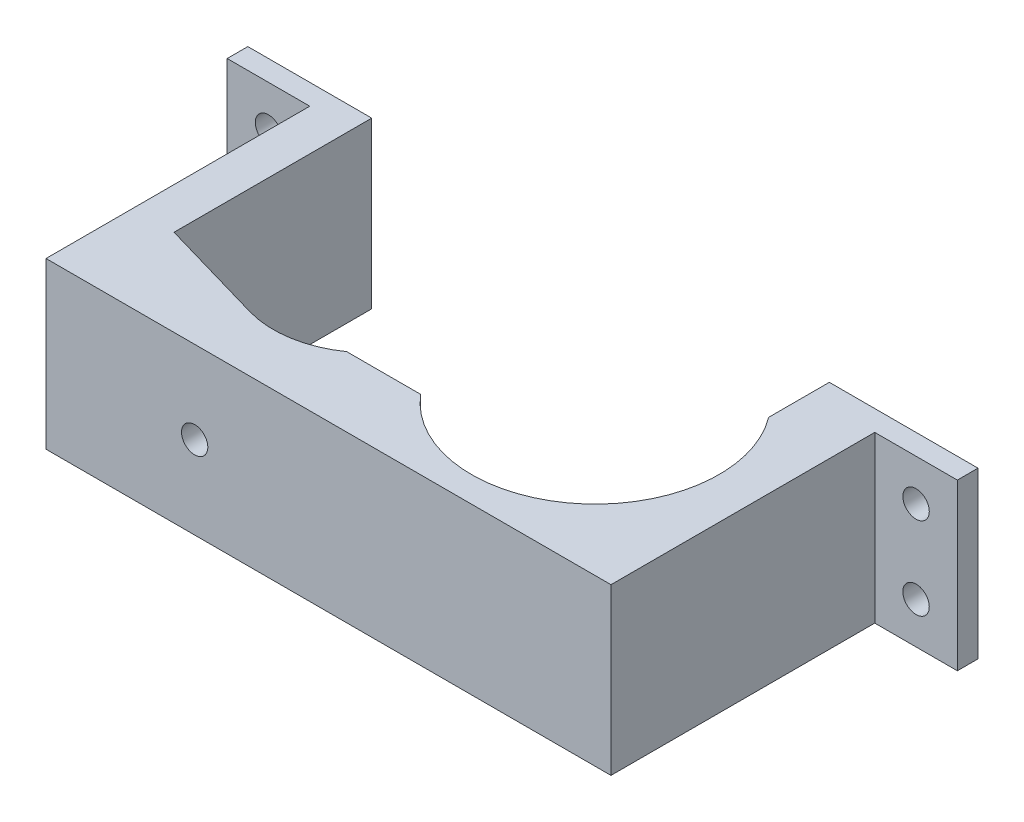
ISO-10303-21;
HEADER;
FILE_DESCRIPTION(('STEP AP214'),'2;1');
FILE_NAME('part.step','',(''),(''),'','','');
FILE_SCHEMA(('AUTOMOTIVE_DESIGN { 1 0 10303 214 1 1 1 1 }'));
ENDSEC;
DATA;
#1=APPLICATION_CONTEXT('core data for automotive mechanical design processes');
#2=APPLICATION_PROTOCOL_DEFINITION('international standard','automotive_design',2000,#1);
#3=PRODUCT_CONTEXT('',#1,'mechanical');
#4=PRODUCT('Part','Part','',(#3));
#5=PRODUCT_RELATED_PRODUCT_CATEGORY('part','',(#4));
#6=PRODUCT_DEFINITION_FORMATION('','',#4);
#7=PRODUCT_DEFINITION_CONTEXT('part definition',#1,'design');
#8=PRODUCT_DEFINITION('design','',#6,#7);
#9=PRODUCT_DEFINITION_SHAPE('','',#8);
#10=(LENGTH_UNIT() NAMED_UNIT(*) SI_UNIT(.MILLI.,.METRE.));
#11=(NAMED_UNIT(*) PLANE_ANGLE_UNIT() SI_UNIT($,.RADIAN.));
#12=(NAMED_UNIT(*) SI_UNIT($,.STERADIAN.) SOLID_ANGLE_UNIT());
#13=UNCERTAINTY_MEASURE_WITH_UNIT(LENGTH_MEASURE(1.E-05),#10,'distance_accuracy_value','');
#14=(GEOMETRIC_REPRESENTATION_CONTEXT(3) GLOBAL_UNCERTAINTY_ASSIGNED_CONTEXT((#13)) GLOBAL_UNIT_ASSIGNED_CONTEXT((#10,
#11,#12)) REPRESENTATION_CONTEXT('',''));
#15=CARTESIAN_POINT('',(0.,0.,0.));
#16=DIRECTION('',(0.,0.,1.));
#17=DIRECTION('',(1.,0.,0.));
#18=AXIS2_PLACEMENT_3D('',#15,#16,#17);
#19=CARTESIAN_POINT('',(-20.574,25.4,-9.65199999999999));
#20=DIRECTION('',(-1.,0.,0.));
#21=DIRECTION('',(0.,0.,1.));
#22=AXIS2_PLACEMENT_3D('',#19,#20,#21);
#23=PLANE('',#22);
#24=DIRECTION('',(0.,0.,-1.));
#25=VECTOR('',#24,1.);
#26=CARTESIAN_POINT('',(-20.574,0.,-9.65199999999999));
#27=LINE('',#26,#25);
#28=CARTESIAN_POINT('',(-20.574,0.,9.65212960437079));
#29=VERTEX_POINT('',#28);
#30=CARTESIAN_POINT('',(-20.574,0.,-20.7467128871305));
#31=VERTEX_POINT('',#30);
#32=EDGE_CURVE('E122',#29,#31,#27,.T.);
#33=ORIENTED_EDGE('',*,*,#32,.T.);
#34=DIRECTION('',(0.,-1.,0.));
#35=VECTOR('',#34,1.);
#36=CARTESIAN_POINT('',(-20.574,25.4,-20.7467128871305));
#37=LINE('',#36,#35);
#38=CARTESIAN_POINT('',(-20.574,25.4,-20.7467128871305));
#39=VERTEX_POINT('',#38);
#40=EDGE_CURVE('E54',#39,#31,#37,.T.);
#41=ORIENTED_EDGE('',*,*,#40,.F.);
#42=DIRECTION('',(0.,0.,-1.));
#43=VECTOR('',#42,1.);
#44=CARTESIAN_POINT('',(-20.574,25.4,-9.65199999999999));
#45=LINE('',#44,#43);
#46=CARTESIAN_POINT('',(-20.574,25.4,9.65212960437079));
#47=VERTEX_POINT('',#46);
#48=EDGE_CURVE('E128',#47,#39,#45,.T.);
#49=ORIENTED_EDGE('',*,*,#48,.F.);
#50=DIRECTION('',(0.,-1.,0.));
#51=VECTOR('',#50,1.);
#52=CARTESIAN_POINT('',(-20.574,25.4,9.65212960437079));
#53=LINE('',#52,#51);
#54=EDGE_CURVE('E191',#47,#29,#53,.T.);
#55=ORIENTED_EDGE('',*,*,#54,.T.);
#56=EDGE_LOOP('',(#33,#41,#49,#55));
#57=FACE_BOUND('',#56,.T.);
#58=ADVANCED_FACE('F41',(#57),#23,.F.);
#59=CARTESIAN_POINT('',(-39.624,25.4,-20.7467128871305));
#60=DIRECTION('',(0.,0.,1.));
#61=DIRECTION('',(1.,0.,0.));
#62=AXIS2_PLACEMENT_3D('',#59,#60,#61);
#63=PLANE('',#62);
#64=CARTESIAN_POINT('',(-33.274,6.35,-20.7467128871305));
#65=DIRECTION('',(0.,0.,1.));
#66=DIRECTION('',(1.,0.,0.));
#67=AXIS2_PLACEMENT_3D('',#64,#65,#66);
#68=CIRCLE('',#67,2.032);
#69=CARTESIAN_POINT('',(-31.242,6.35,-20.7467128871305));
#70=VERTEX_POINT('',#69);
#71=EDGE_CURVE('E322',#70,#70,#68,.T.);
#72=ORIENTED_EDGE('',*,*,#71,.T.);
#73=EDGE_LOOP('',(#72));
#74=FACE_BOUND('',#73,.T.);
#75=CARTESIAN_POINT('',(-33.274,19.05,-20.7467128871305));
#76=DIRECTION('',(0.,0.,1.));
#77=DIRECTION('',(1.,0.,0.));
#78=AXIS2_PLACEMENT_3D('',#75,#76,#77);
#79=CIRCLE('',#78,2.03200000000002);
#80=CARTESIAN_POINT('',(-31.242,19.05,-20.7467128871305));
#81=VERTEX_POINT('',#80);
#82=EDGE_CURVE('E197',#81,#81,#79,.T.);
#83=ORIENTED_EDGE('',*,*,#82,.T.);
#84=EDGE_LOOP('',(#83));
#85=FACE_BOUND('',#84,.T.);
#86=DIRECTION('',(-1.,0.,0.));
#87=VECTOR('',#86,1.);
#88=CARTESIAN_POINT('',(-39.624,0.,-20.7467128871305));
#89=LINE('',#88,#87);
#90=CARTESIAN_POINT('',(-39.624,0.,-20.7467128871305));
#91=VERTEX_POINT('',#90);
#92=EDGE_CURVE('E196',#31,#91,#89,.T.);
#93=ORIENTED_EDGE('',*,*,#92,.T.);
#94=DIRECTION('',(0.,-1.,0.));
#95=VECTOR('',#94,1.);
#96=CARTESIAN_POINT('',(-39.624,25.4,-20.7467128871305));
#97=LINE('',#96,#95);
#98=CARTESIAN_POINT('',(-39.624,25.4,-20.7467128871305));
#99=VERTEX_POINT('',#98);
#100=EDGE_CURVE('E258',#99,#91,#97,.T.);
#101=ORIENTED_EDGE('',*,*,#100,.F.);
#102=DIRECTION('',(-1.,0.,0.));
#103=VECTOR('',#102,1.);
#104=CARTESIAN_POINT('',(-39.624,25.4,-20.7467128871305));
#105=LINE('',#104,#103);
#106=EDGE_CURVE('E265',#39,#99,#105,.T.);
#107=ORIENTED_EDGE('',*,*,#106,.F.);
#108=ORIENTED_EDGE('',*,*,#40,.T.);
#109=EDGE_LOOP('',(#93,#101,#107,#108));
#110=FACE_BOUND('',#109,.T.);
#111=ADVANCED_FACE('F263',(#74,#85,#110),#63,.F.);
#112=CARTESIAN_POINT('',(-39.624,25.4,-20.7467128871305));
#113=DIRECTION('',(1.,0.,0.));
#114=DIRECTION('',(0.,0.,-1.));
#115=AXIS2_PLACEMENT_3D('',#112,#113,#114);
#116=PLANE('',#115);
#117=DIRECTION('',(0.,0.,1.));
#118=VECTOR('',#117,1.);
#119=CARTESIAN_POINT('',(-39.624,0.,-20.7467128871305));
#120=LINE('',#119,#118);
#121=CARTESIAN_POINT('',(-39.624,0.,-17.5717128871305));
#122=VERTEX_POINT('',#121);
#123=EDGE_CURVE('E199',#91,#122,#120,.T.);
#124=ORIENTED_EDGE('',*,*,#123,.T.);
#125=DIRECTION('',(0.,-1.,0.));
#126=VECTOR('',#125,1.);
#127=CARTESIAN_POINT('',(-39.624,25.4,-17.5717128871305));
#128=LINE('',#127,#126);
#129=CARTESIAN_POINT('',(-39.624,25.4,-17.5717128871305));
#130=VERTEX_POINT('',#129);
#131=EDGE_CURVE('E255',#130,#122,#128,.T.);
#132=ORIENTED_EDGE('',*,*,#131,.F.);
#133=DIRECTION('',(0.,0.,1.));
#134=VECTOR('',#133,1.);
#135=CARTESIAN_POINT('',(-39.624,25.4,-20.7467128871305));
#136=LINE('',#135,#134);
#137=EDGE_CURVE('E281',#99,#130,#136,.T.);
#138=ORIENTED_EDGE('',*,*,#137,.F.);
#139=ORIENTED_EDGE('',*,*,#100,.T.);
#140=EDGE_LOOP('',(#124,#132,#138,#139));
#141=FACE_BOUND('',#140,.T.);
#142=ADVANCED_FACE('F272',(#141),#116,.F.);
#143=CARTESIAN_POINT('',(-39.624,25.4,-17.5717128871305));
#144=DIRECTION('',(0.,0.,-1.));
#145=DIRECTION('',(-1.,0.,0.));
#146=AXIS2_PLACEMENT_3D('',#143,#144,#145);
#147=PLANE('',#146);
#148=CARTESIAN_POINT('',(-33.274,6.35,-17.5717128871305));
#149=DIRECTION('',(0.,0.,1.));
#150=DIRECTION('',(1.,0.,0.));
#151=AXIS2_PLACEMENT_3D('',#148,#149,#150);
#152=CIRCLE('',#151,2.032);
#153=CARTESIAN_POINT('',(-31.242,6.35,-17.5717128871305));
#154=VERTEX_POINT('',#153);
#155=EDGE_CURVE('E326',#154,#154,#152,.T.);
#156=ORIENTED_EDGE('',*,*,#155,.F.);
#157=EDGE_LOOP('',(#156));
#158=FACE_BOUND('',#157,.T.);
#159=CARTESIAN_POINT('',(-33.274,19.05,-17.5717128871305));
#160=DIRECTION('',(0.,0.,1.));
#161=DIRECTION('',(1.,0.,0.));
#162=AXIS2_PLACEMENT_3D('',#159,#160,#161);
#163=CIRCLE('',#162,2.03200000000002);
#164=CARTESIAN_POINT('',(-31.242,19.05,-17.5717128871305));
#165=VERTEX_POINT('',#164);
#166=EDGE_CURVE('E325',#165,#165,#163,.T.);
#167=ORIENTED_EDGE('',*,*,#166,.F.);
#168=EDGE_LOOP('',(#167));
#169=FACE_BOUND('',#168,.T.);
#170=DIRECTION('',(1.,0.,0.));
#171=VECTOR('',#170,1.);
#172=CARTESIAN_POINT('',(-39.624,0.,-17.5717128871305));
#173=LINE('',#172,#171);
#174=CARTESIAN_POINT('',(-26.924,0.,-17.5717128871305));
#175=VERTEX_POINT('',#174);
#176=EDGE_CURVE('E201',#122,#175,#173,.T.);
#177=ORIENTED_EDGE('',*,*,#176,.T.);
#178=DIRECTION('',(0.,-1.,0.));
#179=VECTOR('',#178,1.);
#180=CARTESIAN_POINT('',(-26.924,25.4,-17.5717128871305));
#181=LINE('',#180,#179);
#182=CARTESIAN_POINT('',(-26.924,25.4,-17.5717128871305));
#183=VERTEX_POINT('',#182);
#184=EDGE_CURVE('E252',#183,#175,#181,.T.);
#185=ORIENTED_EDGE('',*,*,#184,.F.);
#186=DIRECTION('',(1.,0.,0.));
#187=VECTOR('',#186,1.);
#188=CARTESIAN_POINT('',(-39.624,25.4,-17.5717128871305));
#189=LINE('',#188,#187);
#190=EDGE_CURVE('E278',#130,#183,#189,.T.);
#191=ORIENTED_EDGE('',*,*,#190,.F.);
#192=ORIENTED_EDGE('',*,*,#131,.T.);
#193=EDGE_LOOP('',(#177,#185,#191,#192));
#194=FACE_BOUND('',#193,.T.);
#195=ADVANCED_FACE('F276',(#158,#169,#194),#147,.F.);
#196=CARTESIAN_POINT('',(-26.924,25.4,22.9871296043708));
#197=DIRECTION('',(1.,0.,0.));
#198=DIRECTION('',(0.,0.,-1.));
#199=AXIS2_PLACEMENT_3D('',#196,#197,#198);
#200=PLANE('',#199);
#201=DIRECTION('',(0.,0.,1.));
#202=VECTOR('',#201,1.);
#203=CARTESIAN_POINT('',(-26.924,0.,22.9871296043708));
#204=LINE('',#203,#202);
#205=CARTESIAN_POINT('',(-26.924,0.,22.9871296043708));
#206=VERTEX_POINT('',#205);
#207=EDGE_CURVE('E204',#175,#206,#204,.T.);
#208=ORIENTED_EDGE('',*,*,#207,.T.);
#209=DIRECTION('',(0.,-1.,0.));
#210=VECTOR('',#209,1.);
#211=CARTESIAN_POINT('',(-26.924,25.4,22.9871296043708));
#212=LINE('',#211,#210);
#213=CARTESIAN_POINT('',(-26.924,25.4,22.9871296043708));
#214=VERTEX_POINT('',#213);
#215=EDGE_CURVE('E249',#214,#206,#212,.T.);
#216=ORIENTED_EDGE('',*,*,#215,.F.);
#217=DIRECTION('',(0.,0.,1.));
#218=VECTOR('',#217,1.);
#219=CARTESIAN_POINT('',(-26.924,25.4,-17.5717128871305));
#220=LINE('',#219,#218);
#221=EDGE_CURVE('E280',#183,#214,#220,.T.);
#222=ORIENTED_EDGE('',*,*,#221,.F.);
#223=ORIENTED_EDGE('',*,*,#184,.T.);
#224=EDGE_LOOP('',(#208,#216,#222,#223));
#225=FACE_BOUND('',#224,.T.);
#226=ADVANCED_FACE('F343',(#225),#200,.F.);
#227=CARTESIAN_POINT('',(59.9440000000002,25.4,22.9871296043708));
#228=DIRECTION('',(0.,0.,-1.));
#229=DIRECTION('',(-1.,0.,0.));
#230=AXIS2_PLACEMENT_3D('',#227,#228,#229);
#231=PLANE('',#230);
#232=CARTESIAN_POINT('',(-4.06400000000001,12.7,22.9871296043708));
#233=DIRECTION('',(0.,0.,1.));
#234=DIRECTION('',(1.,0.,0.));
#235=AXIS2_PLACEMENT_3D('',#232,#233,#234);
#236=CIRCLE('',#235,2.01929999999999);
#237=CARTESIAN_POINT('',(-2.04470000000002,12.7,22.9871296043708));
#238=VERTEX_POINT('',#237);
#239=EDGE_CURVE('E311',#238,#238,#236,.T.);
#240=ORIENTED_EDGE('',*,*,#239,.F.);
#241=EDGE_LOOP('',(#240));
#242=FACE_BOUND('',#241,.T.);
#243=DIRECTION('',(1.,0.,0.));
#244=VECTOR('',#243,1.);
#245=CARTESIAN_POINT('',(59.9440000000002,0.,22.9871296043708));
#246=LINE('',#245,#244);
#247=CARTESIAN_POINT('',(59.9440000000002,0.,22.9871296043708));
#248=VERTEX_POINT('',#247);
#249=EDGE_CURVE('E206',#206,#248,#246,.T.);
#250=ORIENTED_EDGE('',*,*,#249,.T.);
#251=DIRECTION('',(0.,-1.,0.));
#252=VECTOR('',#251,1.);
#253=CARTESIAN_POINT('',(59.9440000000002,25.4,22.9871296043708));
#254=LINE('',#253,#252);
#255=CARTESIAN_POINT('',(59.9440000000002,25.4,22.9871296043708));
#256=VERTEX_POINT('',#255);
#257=EDGE_CURVE('E246',#256,#248,#254,.T.);
#258=ORIENTED_EDGE('',*,*,#257,.F.);
#259=DIRECTION('',(1.,0.,0.));
#260=VECTOR('',#259,1.);
#261=CARTESIAN_POINT('',(59.9440000000002,25.4,22.9871296043708));
#262=LINE('',#261,#260);
#263=EDGE_CURVE('E283',#214,#256,#262,.T.);
#264=ORIENTED_EDGE('',*,*,#263,.F.);
#265=ORIENTED_EDGE('',*,*,#215,.T.);
#266=EDGE_LOOP('',(#250,#258,#264,#265));
#267=FACE_BOUND('',#266,.T.);
#268=ADVANCED_FACE('F350',(#242,#267),#231,.F.);
#269=CARTESIAN_POINT('',(59.9440000000002,25.4,-17.5717128871305));
#270=DIRECTION('',(-1.,0.,0.));
#271=DIRECTION('',(0.,0.,1.));
#272=AXIS2_PLACEMENT_3D('',#269,#270,#271);
#273=PLANE('',#272);
#274=DIRECTION('',(0.,0.,-1.));
#275=VECTOR('',#274,1.);
#276=CARTESIAN_POINT('',(59.9440000000002,0.,-17.5717128871305));
#277=LINE('',#276,#275);
#278=CARTESIAN_POINT('',(59.9440000000002,0.,-17.5717128871305));
#279=VERTEX_POINT('',#278);
#280=EDGE_CURVE('E209',#248,#279,#277,.T.);
#281=ORIENTED_EDGE('',*,*,#280,.T.);
#282=DIRECTION('',(0.,-1.,0.));
#283=VECTOR('',#282,1.);
#284=CARTESIAN_POINT('',(59.9440000000002,25.4,-17.5717128871305));
#285=LINE('',#284,#283);
#286=CARTESIAN_POINT('',(59.9440000000002,25.4,-17.5717128871305));
#287=VERTEX_POINT('',#286);
#288=EDGE_CURVE('E243',#287,#279,#285,.T.);
#289=ORIENTED_EDGE('',*,*,#288,.F.);
#290=DIRECTION('',(0.,0.,-1.));
#291=VECTOR('',#290,1.);
#292=CARTESIAN_POINT('',(59.9440000000002,25.4,12.8271296043708));
#293=LINE('',#292,#291);
#294=EDGE_CURVE('E289',#256,#287,#293,.T.);
#295=ORIENTED_EDGE('',*,*,#294,.F.);
#296=ORIENTED_EDGE('',*,*,#257,.T.);
#297=EDGE_LOOP('',(#281,#289,#295,#296));
#298=FACE_BOUND('',#297,.T.);
#299=ADVANCED_FACE('F406',(#298),#273,.F.);
#300=CARTESIAN_POINT('',(72.6440000000002,25.4,-17.5717128871305));
#301=DIRECTION('',(0.,0.,-1.));
#302=DIRECTION('',(-1.,0.,0.));
#303=AXIS2_PLACEMENT_3D('',#300,#301,#302);
#304=PLANE('',#303);
#305=CARTESIAN_POINT('',(66.2940000000002,19.05,-17.5717128871305));
#306=DIRECTION('',(0.,0.,1.));
#307=DIRECTION('',(1.,0.,0.));
#308=AXIS2_PLACEMENT_3D('',#305,#306,#307);
#309=CIRCLE('',#308,2.03200000000002);
#310=CARTESIAN_POINT('',(68.3260000000003,19.05,-17.5717128871305));
#311=VERTEX_POINT('',#310);
#312=EDGE_CURVE('E320',#311,#311,#309,.T.);
#313=ORIENTED_EDGE('',*,*,#312,.F.);
#314=EDGE_LOOP('',(#313));
#315=FACE_BOUND('',#314,.T.);
#316=CARTESIAN_POINT('',(66.2940000000002,6.35,-17.5717128871305));
#317=DIRECTION('',(0.,0.,1.));
#318=DIRECTION('',(1.,0.,0.));
#319=AXIS2_PLACEMENT_3D('',#316,#317,#318);
#320=CIRCLE('',#319,2.03200000000001);
#321=CARTESIAN_POINT('',(68.3260000000002,6.35,-17.5717128871305));
#322=VERTEX_POINT('',#321);
#323=EDGE_CURVE('E310',#322,#322,#320,.T.);
#324=ORIENTED_EDGE('',*,*,#323,.F.);
#325=EDGE_LOOP('',(#324));
#326=FACE_BOUND('',#325,.T.);
#327=DIRECTION('',(1.,0.,0.));
#328=VECTOR('',#327,1.);
#329=CARTESIAN_POINT('',(72.6440000000002,0.,-17.5717128871305));
#330=LINE('',#329,#328);
#331=CARTESIAN_POINT('',(72.6440000000002,0.,-17.5717128871305));
#332=VERTEX_POINT('',#331);
#333=EDGE_CURVE('E211',#279,#332,#330,.T.);
#334=ORIENTED_EDGE('',*,*,#333,.T.);
#335=DIRECTION('',(0.,-1.,0.));
#336=VECTOR('',#335,1.);
#337=CARTESIAN_POINT('',(72.6440000000002,25.4,-17.5717128871305));
#338=LINE('',#337,#336);
#339=CARTESIAN_POINT('',(72.6440000000002,25.4,-17.5717128871305));
#340=VERTEX_POINT('',#339);
#341=EDGE_CURVE('E240',#340,#332,#338,.T.);
#342=ORIENTED_EDGE('',*,*,#341,.F.);
#343=DIRECTION('',(1.,0.,0.));
#344=VECTOR('',#343,1.);
#345=CARTESIAN_POINT('',(72.6440000000002,25.4,-17.5717128871305));
#346=LINE('',#345,#344);
#347=EDGE_CURVE('E291',#287,#340,#346,.T.);
#348=ORIENTED_EDGE('',*,*,#347,.F.);
#349=ORIENTED_EDGE('',*,*,#288,.T.);
#350=EDGE_LOOP('',(#334,#342,#348,#349));
#351=FACE_BOUND('',#350,.T.);
#352=ADVANCED_FACE('F402',(#315,#326,#351),#304,.F.);
#353=CARTESIAN_POINT('',(72.6440000000002,25.4,-20.7467128871305));
#354=DIRECTION('',(-1.,0.,0.));
#355=DIRECTION('',(0.,0.,1.));
#356=AXIS2_PLACEMENT_3D('',#353,#354,#355);
#357=PLANE('',#356);
#358=DIRECTION('',(0.,0.,-1.));
#359=VECTOR('',#358,1.);
#360=CARTESIAN_POINT('',(72.6440000000002,0.,-20.7467128871305));
#361=LINE('',#360,#359);
#362=CARTESIAN_POINT('',(72.6440000000002,0.,-20.7467128871305));
#363=VERTEX_POINT('',#362);
#364=EDGE_CURVE('E213',#332,#363,#361,.T.);
#365=ORIENTED_EDGE('',*,*,#364,.T.);
#366=DIRECTION('',(0.,-1.,0.));
#367=VECTOR('',#366,1.);
#368=CARTESIAN_POINT('',(72.6440000000002,25.4,-20.7467128871305));
#369=LINE('',#368,#367);
#370=CARTESIAN_POINT('',(72.6440000000002,25.4,-20.7467128871305));
#371=VERTEX_POINT('',#370);
#372=EDGE_CURVE('E237',#371,#363,#369,.T.);
#373=ORIENTED_EDGE('',*,*,#372,.F.);
#374=DIRECTION('',(0.,0.,-1.));
#375=VECTOR('',#374,1.);
#376=CARTESIAN_POINT('',(72.6440000000002,25.4,-20.7467128871305));
#377=LINE('',#376,#375);
#378=EDGE_CURVE('E293',#340,#371,#377,.T.);
#379=ORIENTED_EDGE('',*,*,#378,.F.);
#380=ORIENTED_EDGE('',*,*,#341,.T.);
#381=EDGE_LOOP('',(#365,#373,#379,#380));
#382=FACE_BOUND('',#381,.T.);
#383=ADVANCED_FACE('F398',(#382),#357,.F.);
#384=CARTESIAN_POINT('',(49.7840000000002,25.4,-20.7467128871305));
#385=DIRECTION('',(0.,0.,1.));
#386=DIRECTION('',(1.,0.,0.));
#387=AXIS2_PLACEMENT_3D('',#384,#385,#386);
#388=PLANE('',#387);
#389=CARTESIAN_POINT('',(66.2940000000002,19.05,-20.7467128871305));
#390=DIRECTION('',(0.,0.,1.));
#391=DIRECTION('',(1.,0.,0.));
#392=AXIS2_PLACEMENT_3D('',#389,#390,#391);
#393=CIRCLE('',#392,2.03200000000002);
#394=CARTESIAN_POINT('',(68.3260000000003,19.05,-20.7467128871305));
#395=VERTEX_POINT('',#394);
#396=EDGE_CURVE('E329',#395,#395,#393,.T.);
#397=ORIENTED_EDGE('',*,*,#396,.T.);
#398=EDGE_LOOP('',(#397));
#399=FACE_BOUND('',#398,.T.);
#400=CARTESIAN_POINT('',(66.2940000000002,6.35,-20.7467128871305));
#401=DIRECTION('',(0.,0.,1.));
#402=DIRECTION('',(1.,0.,0.));
#403=AXIS2_PLACEMENT_3D('',#400,#401,#402);
#404=CIRCLE('',#403,2.03200000000001);
#405=CARTESIAN_POINT('',(68.3260000000002,6.35,-20.7467128871305));
#406=VERTEX_POINT('',#405);
#407=EDGE_CURVE('E314',#406,#406,#404,.T.);
#408=ORIENTED_EDGE('',*,*,#407,.T.);
#409=EDGE_LOOP('',(#408));
#410=FACE_BOUND('',#409,.T.);
#411=DIRECTION('',(-1.,0.,0.));
#412=VECTOR('',#411,1.);
#413=CARTESIAN_POINT('',(49.7840000000002,0.,-20.7467128871305));
#414=LINE('',#413,#412);
#415=CARTESIAN_POINT('',(49.7840000000002,0.,-20.7467128871305));
#416=VERTEX_POINT('',#415);
#417=EDGE_CURVE('E215',#363,#416,#414,.T.);
#418=ORIENTED_EDGE('',*,*,#417,.T.);
#419=DIRECTION('',(0.,-1.,0.));
#420=VECTOR('',#419,1.);
#421=CARTESIAN_POINT('',(49.7840000000002,25.4,-20.7467128871305));
#422=LINE('',#421,#420);
#423=CARTESIAN_POINT('',(49.7840000000002,25.4,-20.7467128871305));
#424=VERTEX_POINT('',#423);
#425=EDGE_CURVE('E234',#424,#416,#422,.T.);
#426=ORIENTED_EDGE('',*,*,#425,.F.);
#427=DIRECTION('',(-1.,0.,0.));
#428=VECTOR('',#427,1.);
#429=CARTESIAN_POINT('',(49.7840000000002,25.4,-20.7467128871305));
#430=LINE('',#429,#428);
#431=EDGE_CURVE('E295',#371,#424,#430,.T.);
#432=ORIENTED_EDGE('',*,*,#431,.F.);
#433=ORIENTED_EDGE('',*,*,#372,.T.);
#434=EDGE_LOOP('',(#418,#426,#432,#433));
#435=FACE_BOUND('',#434,.T.);
#436=ADVANCED_FACE('F395',(#399,#410,#435),#388,.F.);
#437=CARTESIAN_POINT('',(49.7840000000002,25.4,-20.7467128871305));
#438=DIRECTION('',(1.,0.,0.));
#439=DIRECTION('',(0.,0.,-1.));
#440=AXIS2_PLACEMENT_3D('',#437,#438,#439);
#441=PLANE('',#440);
#442=DIRECTION('',(0.,0.,1.));
#443=VECTOR('',#442,1.);
#444=CARTESIAN_POINT('',(49.7840000000002,0.,-20.7467128871305));
#445=LINE('',#444,#443);
#446=CARTESIAN_POINT('',(49.7840000000002,0.,-11.4299999999958));
#447=VERTEX_POINT('',#446);
#448=EDGE_CURVE('E217',#416,#447,#445,.T.);
#449=ORIENTED_EDGE('',*,*,#448,.T.);
#450=DIRECTION('',(0.,-1.,0.));
#451=VECTOR('',#450,1.);
#452=CARTESIAN_POINT('',(49.7840000000002,25.4,-11.4299999999958));
#453=LINE('',#452,#451);
#454=CARTESIAN_POINT('',(49.7840000000002,25.4,-11.4299999999958));
#455=VERTEX_POINT('',#454);
#456=EDGE_CURVE('E231',#455,#447,#453,.T.);
#457=ORIENTED_EDGE('',*,*,#456,.F.);
#458=DIRECTION('',(0.,0.,1.));
#459=VECTOR('',#458,1.);
#460=CARTESIAN_POINT('',(49.7840000000002,25.4,-20.7467128871305));
#461=LINE('',#460,#459);
#462=EDGE_CURVE('E297',#424,#455,#461,.T.);
#463=ORIENTED_EDGE('',*,*,#462,.F.);
#464=ORIENTED_EDGE('',*,*,#425,.T.);
#465=EDGE_LOOP('',(#449,#457,#463,#464));
#466=FACE_BOUND('',#465,.T.);
#467=ADVANCED_FACE('F303',(#466),#441,.F.);
#468=CARTESIAN_POINT('',(34.5440000000002,25.4,4.19456136491192E-12));
#469=DIRECTION('',(0.,-1.,0.));
#470=DIRECTION('',(0.,0.,-1.));
#471=AXIS2_PLACEMENT_3D('',#468,#469,#470);
#472=CYLINDRICAL_SURFACE('',#471,19.05);
#473=CARTESIAN_POINT('',(34.5440000000002,0.,4.19456136491192E-12));
#474=DIRECTION('',(0.,-1.,0.));
#475=DIRECTION('',(0.,0.,1.));
#476=AXIS2_PLACEMENT_3D('',#473,#474,#475);
#477=CIRCLE('',#476,19.05);
#478=CARTESIAN_POINT('',(19.9745482791847,0.,12.2732871128695));
#479=VERTEX_POINT('',#478);
#480=EDGE_CURVE('E219',#447,#479,#477,.T.);
#481=ORIENTED_EDGE('',*,*,#480,.T.);
#482=DIRECTION('',(0.,-1.,0.));
#483=VECTOR('',#482,1.);
#484=CARTESIAN_POINT('',(19.9745482791847,25.4,12.2732871128695));
#485=LINE('',#484,#483);
#486=CARTESIAN_POINT('',(19.9745482791847,25.4,12.2732871128695));
#487=VERTEX_POINT('',#486);
#488=EDGE_CURVE('E184',#487,#479,#485,.T.);
#489=ORIENTED_EDGE('',*,*,#488,.F.);
#490=CARTESIAN_POINT('',(34.5440000000002,25.4,4.19456136491192E-12));
#491=DIRECTION('',(0.,-1.,0.));
#492=DIRECTION('',(0.,0.,1.));
#493=AXIS2_PLACEMENT_3D('',#490,#491,#492);
#494=CIRCLE('',#493,19.05);
#495=EDGE_CURVE('E171',#455,#487,#494,.T.);
#496=ORIENTED_EDGE('',*,*,#495,.F.);
#497=ORIENTED_EDGE('',*,*,#456,.T.);
#498=EDGE_LOOP('',(#481,#489,#496,#497));
#499=FACE_BOUND('',#498,.T.);
#500=ADVANCED_FACE('F307',(#499),#472,.F.);
#501=CARTESIAN_POINT('',(8.59971195986917,25.4,12.2732871128695));
#502=DIRECTION('',(0.,0.,1.));
#503=DIRECTION('',(1.,0.,0.));
#504=AXIS2_PLACEMENT_3D('',#501,#502,#503);
#505=PLANE('',#504);
#506=DIRECTION('',(-1.,0.,0.));
#507=VECTOR('',#506,1.);
#508=CARTESIAN_POINT('',(8.59971195986917,0.,12.2732871128695));
#509=LINE('',#508,#507);
#510=CARTESIAN_POINT('',(8.59971195986916,0.,12.2732871128695));
#511=VERTEX_POINT('',#510);
#512=EDGE_CURVE('E180',#479,#511,#509,.T.);
#513=ORIENTED_EDGE('',*,*,#512,.T.);
#514=DIRECTION('',(0.,-1.,0.));
#515=VECTOR('',#514,1.);
#516=CARTESIAN_POINT('',(8.59971195986916,25.4,12.2732871128695));
#517=LINE('',#516,#515);
#518=CARTESIAN_POINT('',(8.59971195986916,25.4,12.2732871128695));
#519=VERTEX_POINT('',#518);
#520=EDGE_CURVE('E177',#519,#511,#517,.T.);
#521=ORIENTED_EDGE('',*,*,#520,.F.);
#522=DIRECTION('',(-1.,0.,0.));
#523=VECTOR('',#522,1.);
#524=CARTESIAN_POINT('',(8.59971195986917,25.4,12.2732871128695));
#525=LINE('',#524,#523);
#526=EDGE_CURVE('E164',#487,#519,#525,.T.);
#527=ORIENTED_EDGE('',*,*,#526,.F.);
#528=ORIENTED_EDGE('',*,*,#488,.T.);
#529=EDGE_LOOP('',(#513,#521,#527,#528));
#530=FACE_BOUND('',#529,.T.);
#531=ADVANCED_FACE('F178',(#530),#505,.F.);
#532=CARTESIAN_POINT('',(0.,25.4,0.));
#533=DIRECTION('',(0.,-1.,0.));
#534=DIRECTION('',(0.,0.,-1.));
#535=AXIS2_PLACEMENT_3D('',#532,#533,#534);
#536=CYLINDRICAL_SURFACE('',#535,14.9862811380157);
#537=DIRECTION('',(0.,-1.,0.));
#538=VECTOR('',#537,1.);
#539=CARTESIAN_POINT('',(-4.16201958345776,25.4,14.3967432197202));
#540=LINE('',#539,#538);
#541=CARTESIAN_POINT('',(-4.16201958345776,10.683080405356,14.3967432197202));
#542=VERTEX_POINT('',#541);
#543=CARTESIAN_POINT('',(-4.16201958345776,0.,14.3967432197202));
#544=VERTEX_POINT('',#543);
#545=EDGE_CURVE('E228',#542,#544,#540,.T.);
#546=ORIENTED_EDGE('',*,*,#545,.F.);
#547=CARTESIAN_POINT('',(-4.16201958345776,10.683080405356,14.3967432197202));
#548=CARTESIAN_POINT('',(-4.10518655365808,10.6803198385047,14.4131751859458));
#549=CARTESIAN_POINT('',(-4.04817126170855,10.6799570663627,14.4292909831113));
#550=CARTESIAN_POINT('',(-3.93410885030647,10.6840727063026,14.4608058253478));
#551=CARTESIAN_POINT('',(-3.87706172734988,10.6885518487796,14.4762047619159));
#552=CARTESIAN_POINT('',(-3.70643166926872,10.7093166008282,14.5211833508265));
#553=CARTESIAN_POINT('',(-3.59332569012866,10.7329278324233,14.5495547010112));
#554=CARTESIAN_POINT('',(-3.37186857975921,10.7994924510234,14.6024702423059));
#555=CARTESIAN_POINT('',(-3.26352457258627,10.8424738031192,14.627008830752));
#556=CARTESIAN_POINT('',(-3.05523146794569,10.9468577984105,14.6719299141102));
#557=CARTESIAN_POINT('',(-2.95527622220349,11.0082467967061,14.6923154687782));
#558=CARTESIAN_POINT('',(-2.76950822820195,11.1460091952429,14.7284482438292));
#559=CARTESIAN_POINT('',(-2.68339305233481,11.2219468262098,14.7443031986223));
#560=CARTESIAN_POINT('',(-2.52497732752565,11.3877032243555,14.7722577017791));
#561=CARTESIAN_POINT('',(-2.45267913407624,11.4775243536538,14.7843566100385));
#562=CARTESIAN_POINT('',(-2.32552170969287,11.6665633129612,14.8048861488369));
#563=CARTESIAN_POINT('',(-2.27035026245078,11.765564063393,14.8133836332054));
#564=CARTESIAN_POINT('',(-2.17727742053291,11.9715620482139,14.8273501195585));
#565=CARTESIAN_POINT('',(-2.13937377625522,12.0785582388637,14.8328195160541));
#566=CARTESIAN_POINT('',(-2.08215862141396,12.2968436698864,14.840959372896));
#567=CARTESIAN_POINT('',(-2.06274027240303,12.4081043260854,14.8436459251482));
#568=CARTESIAN_POINT('',(-2.04269704897467,12.6323411487824,14.8464176283274));
#569=CARTESIAN_POINT('',(-2.0420726000983,12.7453173540668,14.8465027203507));
#570=CARTESIAN_POINT('',(-2.0596302571484,12.9696767514607,14.8440769820687));
#571=CARTESIAN_POINT('',(-2.0777969383829,13.0810611741556,14.8415682808781));
#572=CARTESIAN_POINT('',(-2.13236671063841,13.2991675170066,14.8338257595794));
#573=CARTESIAN_POINT('',(-2.16876932554813,13.4058895588111,14.8285920106177));
#574=CARTESIAN_POINT('',(-2.25871349973572,13.611658771125,14.8151575029018));
#575=CARTESIAN_POINT('',(-2.31225662483818,13.7107052394263,14.8069564730709));
#576=CARTESIAN_POINT('',(-2.434845044784,13.8983254166867,14.787291534779));
#577=CARTESIAN_POINT('',(-2.50389045652486,13.986899046666,14.7758276017134));
#578=CARTESIAN_POINT('',(-2.65550346034768,14.151287931921,14.7493335962098));
#579=CARTESIAN_POINT('',(-2.73809656253263,14.2270785601513,14.7342967716356));
#580=CARTESIAN_POINT('',(-2.91416851546191,14.363693533866,14.7004851857967));
#581=CARTESIAN_POINT('',(-3.00764746386742,14.4245177450655,14.6817103909961));
#582=CARTESIAN_POINT('',(-3.20360875595405,14.5302515182801,14.6402060942297));
#583=CARTESIAN_POINT('',(-3.30617026138259,14.5749994989051,14.6174396861787));
#584=CARTESIAN_POINT('',(-3.51647818294622,14.6468256254687,14.5682752720064));
#585=CARTESIAN_POINT('',(-3.62422378183949,14.673906546779,14.5418778370834));
#586=CARTESIAN_POINT('',(-3.80418967711711,14.7038196355898,14.4955919143991));
#587=CARTESIAN_POINT('',(-3.87583304765222,14.7117955661445,14.4766024282395));
#588=CARTESIAN_POINT('',(-4.01909351398374,14.7200733238102,14.4374879742501));
#589=CARTESIAN_POINT('',(-4.0907103528281,14.7203911247446,14.4173654577215));
#590=CARTESIAN_POINT('',(-4.16201958345776,14.7169195946439,14.3967432197202));
#591=B_SPLINE_CURVE_WITH_KNOTS('',3,(#547,#548,#549,#550,#551,#552,#553,#554,#555,#556,#557,
#558,#559,#560,#561,#562,#563,#564,#565,#566,#567,#568,#569,#570,#571,#572,#573,#574,#575,#576,
#577,#578,#579,#580,#581,#582,#583,#584,#585,#586,#587,#588,#589,#590),.UNSPECIFIED.,.F.,.F.,(4,
2,2,2,2,2,2,2,2,2,2,2,2,2,2,2,2,2,2,2,2,4),(0.,0.177574644653031,0.355176079894113,
0.710272882927685,1.06588399796535,1.42123216069955,1.76724993867882,2.11332665258681,
2.45266320403927,2.7919555350076,3.12927475261364,3.46660160796743,3.80365178826834,
4.14069316918264,4.47776534838401,4.81484006941806,5.15255694110698,5.4902768428193,
5.83130198253635,6.17227353667488,6.39553322515516,6.61832718370004),.UNSPECIFIED.);
#592=CARTESIAN_POINT('',(-4.16201958345776,14.7169195946439,14.3967432197202));
#593=VERTEX_POINT('',#592);
#594=EDGE_CURVE('E11',#542,#593,#591,.T.);
#595=ORIENTED_EDGE('',*,*,#594,.T.);
#596=CARTESIAN_POINT('',(-4.16201958345776,25.4,14.3967432197202));
#597=VERTEX_POINT('',#596);
#598=EDGE_CURVE('E185',#597,#593,#540,.T.);
#599=ORIENTED_EDGE('',*,*,#598,.F.);
#600=CARTESIAN_POINT('',(0.,25.4,0.));
#601=DIRECTION('',(0.,-1.,0.));
#602=DIRECTION('',(0.,0.,1.));
#603=AXIS2_PLACEMENT_3D('',#600,#601,#602);
#604=CIRCLE('',#603,14.9862811380157);
#605=EDGE_CURVE('E168',#519,#597,#604,.T.);
#606=ORIENTED_EDGE('',*,*,#605,.F.);
#607=ORIENTED_EDGE('',*,*,#520,.T.);
#608=CARTESIAN_POINT('',(0.,0.,0.));
#609=DIRECTION('',(0.,-1.,0.));
#610=DIRECTION('',(0.,0.,1.));
#611=AXIS2_PLACEMENT_3D('',#608,#609,#610);
#612=CIRCLE('',#611,14.9862811380157);
#613=EDGE_CURVE('E222',#511,#544,#612,.T.);
#614=ORIENTED_EDGE('',*,*,#613,.T.);
#615=EDGE_LOOP('',(#546,#595,#599,#606,#607,#614));
#616=FACE_BOUND('',#615,.T.);
#617=ADVANCED_FACE('F188',(#616),#536,.F.);
#618=CARTESIAN_POINT('',(-20.574,25.4,9.65212960437079));
#619=DIRECTION('',(-0.27772197419278,0.,0.960661493477523));
#620=DIRECTION('',(0.960661493477523,0.,0.27772197419278));
#621=AXIS2_PLACEMENT_3D('',#618,#619,#620);
#622=PLANE('',#621);
#623=ORIENTED_EDGE('',*,*,#598,.T.);
#624=CARTESIAN_POINT('',(-4.06400000000001,12.7,14.4250801442376));
#625=DIRECTION('',(-0.27772197419278,0.,0.960661493477523));
#626=DIRECTION('',(0.960661493477523,0.,0.27772197419278));
#627=AXIS2_PLACEMENT_3D('',#624,#625,#626);
#628=ELLIPSE('',#627,2.10198911240866,2.01929999999999);
#629=EDGE_CURVE('E60',#593,#542,#628,.T.);
#630=ORIENTED_EDGE('',*,*,#629,.T.);
#631=ORIENTED_EDGE('',*,*,#545,.T.);
#632=DIRECTION('',(-0.960661493477523,0.,-0.27772197419278));
#633=VECTOR('',#632,1.);
#634=CARTESIAN_POINT('',(-20.574,0.,9.65212960437079));
#635=LINE('',#634,#633);
#636=EDGE_CURVE('E224',#544,#29,#635,.T.);
#637=ORIENTED_EDGE('',*,*,#636,.T.);
#638=ORIENTED_EDGE('',*,*,#54,.F.);
#639=DIRECTION('',(-0.960661493477523,0.,-0.27772197419278));
#640=VECTOR('',#639,1.);
#641=CARTESIAN_POINT('',(-20.574,25.4,9.65212960437079));
#642=LINE('',#641,#640);
#643=EDGE_CURVE('E68',#597,#47,#642,.T.);
#644=ORIENTED_EDGE('',*,*,#643,.F.);
#645=EDGE_LOOP('',(#623,#630,#631,#637,#638,#644));
#646=FACE_BOUND('',#645,.T.);
#647=ADVANCED_FACE('F309',(#646),#622,.F.);
#648=CARTESIAN_POINT('',(0.,25.4,0.));
#649=DIRECTION('',(0.,1.,0.));
#650=DIRECTION('',(0.,0.,1.));
#651=AXIS2_PLACEMENT_3D('',#648,#649,#650);
#652=PLANE('',#651);
#653=ORIENTED_EDGE('',*,*,#48,.T.);
#654=ORIENTED_EDGE('',*,*,#106,.T.);
#655=ORIENTED_EDGE('',*,*,#137,.T.);
#656=ORIENTED_EDGE('',*,*,#190,.T.);
#657=ORIENTED_EDGE('',*,*,#221,.T.);
#658=ORIENTED_EDGE('',*,*,#263,.T.);
#659=ORIENTED_EDGE('',*,*,#294,.T.);
#660=ORIENTED_EDGE('',*,*,#347,.T.);
#661=ORIENTED_EDGE('',*,*,#378,.T.);
#662=ORIENTED_EDGE('',*,*,#431,.T.);
#663=ORIENTED_EDGE('',*,*,#462,.T.);
#664=ORIENTED_EDGE('',*,*,#495,.T.);
#665=ORIENTED_EDGE('',*,*,#526,.T.);
#666=ORIENTED_EDGE('',*,*,#605,.T.);
#667=ORIENTED_EDGE('',*,*,#643,.T.);
#668=EDGE_LOOP('',(#653,#654,#655,#656,#657,#658,#659,#660,#661,#662,#663,#664,#665,#666,#667));
#669=FACE_BOUND('',#668,.T.);
#670=ADVANCED_FACE('F166',(#669),#652,.T.);
#671=CARTESIAN_POINT('',(0.,0.,0.));
#672=DIRECTION('',(0.,1.,0.));
#673=DIRECTION('',(0.,0.,1.));
#674=AXIS2_PLACEMENT_3D('',#671,#672,#673);
#675=PLANE('',#674);
#676=ORIENTED_EDGE('',*,*,#32,.F.);
#677=ORIENTED_EDGE('',*,*,#636,.F.);
#678=ORIENTED_EDGE('',*,*,#613,.F.);
#679=ORIENTED_EDGE('',*,*,#512,.F.);
#680=ORIENTED_EDGE('',*,*,#480,.F.);
#681=ORIENTED_EDGE('',*,*,#448,.F.);
#682=ORIENTED_EDGE('',*,*,#417,.F.);
#683=ORIENTED_EDGE('',*,*,#364,.F.);
#684=ORIENTED_EDGE('',*,*,#333,.F.);
#685=ORIENTED_EDGE('',*,*,#280,.F.);
#686=ORIENTED_EDGE('',*,*,#249,.F.);
#687=ORIENTED_EDGE('',*,*,#207,.F.);
#688=ORIENTED_EDGE('',*,*,#176,.F.);
#689=ORIENTED_EDGE('',*,*,#123,.F.);
#690=ORIENTED_EDGE('',*,*,#92,.F.);
#691=EDGE_LOOP('',(#676,#677,#678,#679,#680,#681,#682,#683,#684,#685,#686,#687,#688,#689,#690));
#692=FACE_BOUND('',#691,.T.);
#693=ADVANCED_FACE('F268',(#692),#675,.F.);
#694=CARTESIAN_POINT('',(66.2940000000002,6.35,-20.7467128871305));
#695=DIRECTION('',(0.,0.,1.));
#696=DIRECTION('',(1.,0.,0.));
#697=AXIS2_PLACEMENT_3D('',#694,#695,#696);
#698=CYLINDRICAL_SURFACE('',#697,2.03200000000001);
#699=ORIENTED_EDGE('',*,*,#407,.F.);
#700=EDGE_LOOP('',(#699));
#701=FACE_BOUND('',#700,.T.);
#702=ORIENTED_EDGE('',*,*,#323,.T.);
#703=EDGE_LOOP('',(#702));
#704=FACE_BOUND('',#703,.T.);
#705=ADVANCED_FACE('F377',(#701,#704),#698,.F.);
#706=CARTESIAN_POINT('',(66.2940000000002,19.05,-20.7467128871305));
#707=DIRECTION('',(0.,0.,1.));
#708=DIRECTION('',(1.,0.,0.));
#709=AXIS2_PLACEMENT_3D('',#706,#707,#708);
#710=CYLINDRICAL_SURFACE('',#709,2.03200000000002);
#711=ORIENTED_EDGE('',*,*,#396,.F.);
#712=EDGE_LOOP('',(#711));
#713=FACE_BOUND('',#712,.T.);
#714=ORIENTED_EDGE('',*,*,#312,.T.);
#715=EDGE_LOOP('',(#714));
#716=FACE_BOUND('',#715,.T.);
#717=ADVANCED_FACE('F368',(#713,#716),#710,.F.);
#718=CARTESIAN_POINT('',(-33.274,19.05,-20.7467128871305));
#719=DIRECTION('',(0.,0.,1.));
#720=DIRECTION('',(1.,0.,0.));
#721=AXIS2_PLACEMENT_3D('',#718,#719,#720);
#722=CYLINDRICAL_SURFACE('',#721,2.03200000000002);
#723=ORIENTED_EDGE('',*,*,#82,.F.);
#724=EDGE_LOOP('',(#723));
#725=FACE_BOUND('',#724,.T.);
#726=ORIENTED_EDGE('',*,*,#166,.T.);
#727=EDGE_LOOP('',(#726));
#728=FACE_BOUND('',#727,.T.);
#729=ADVANCED_FACE('F340',(#725,#728),#722,.F.);
#730=CARTESIAN_POINT('',(-33.274,6.35,-20.7467128871305));
#731=DIRECTION('',(0.,0.,1.));
#732=DIRECTION('',(1.,0.,0.));
#733=AXIS2_PLACEMENT_3D('',#730,#731,#732);
#734=CYLINDRICAL_SURFACE('',#733,2.032);
#735=ORIENTED_EDGE('',*,*,#71,.F.);
#736=EDGE_LOOP('',(#735));
#737=FACE_BOUND('',#736,.T.);
#738=ORIENTED_EDGE('',*,*,#155,.T.);
#739=EDGE_LOOP('',(#738));
#740=FACE_BOUND('',#739,.T.);
#741=ADVANCED_FACE('F367',(#737,#740),#734,.F.);
#742=CARTESIAN_POINT('',(-4.06400000000001,12.7,22.9871296043708));
#743=DIRECTION('',(0.,0.,1.));
#744=DIRECTION('',(1.,0.,0.));
#745=AXIS2_PLACEMENT_3D('',#742,#743,#744);
#746=CYLINDRICAL_SURFACE('',#745,2.01929999999999);
#747=ORIENTED_EDGE('',*,*,#239,.T.);
#748=EDGE_LOOP('',(#747));
#749=FACE_BOUND('',#748,.T.);
#750=ORIENTED_EDGE('',*,*,#594,.F.);
#751=ORIENTED_EDGE('',*,*,#629,.F.);
#752=EDGE_LOOP('',(#750,#751));
#753=FACE_BOUND('',#752,.T.);
#754=ADVANCED_FACE('F374',(#749,#753),#746,.F.);
#755=CLOSED_SHELL('',(#58,#111,#142,#195,#226,#268,#299,#352,#383,#436,#467,#500,#531,#617,#647,
#670,#693,#705,#717,#729,#741,#754));
#756=MANIFOLD_SOLID_BREP('B2',#755);
#757=ADVANCED_BREP_SHAPE_REPRESENTATION('',(#18,#756),#14);
#758=SHAPE_DEFINITION_REPRESENTATION(#9,#757);
ENDSEC;
END-ISO-10303-21;
